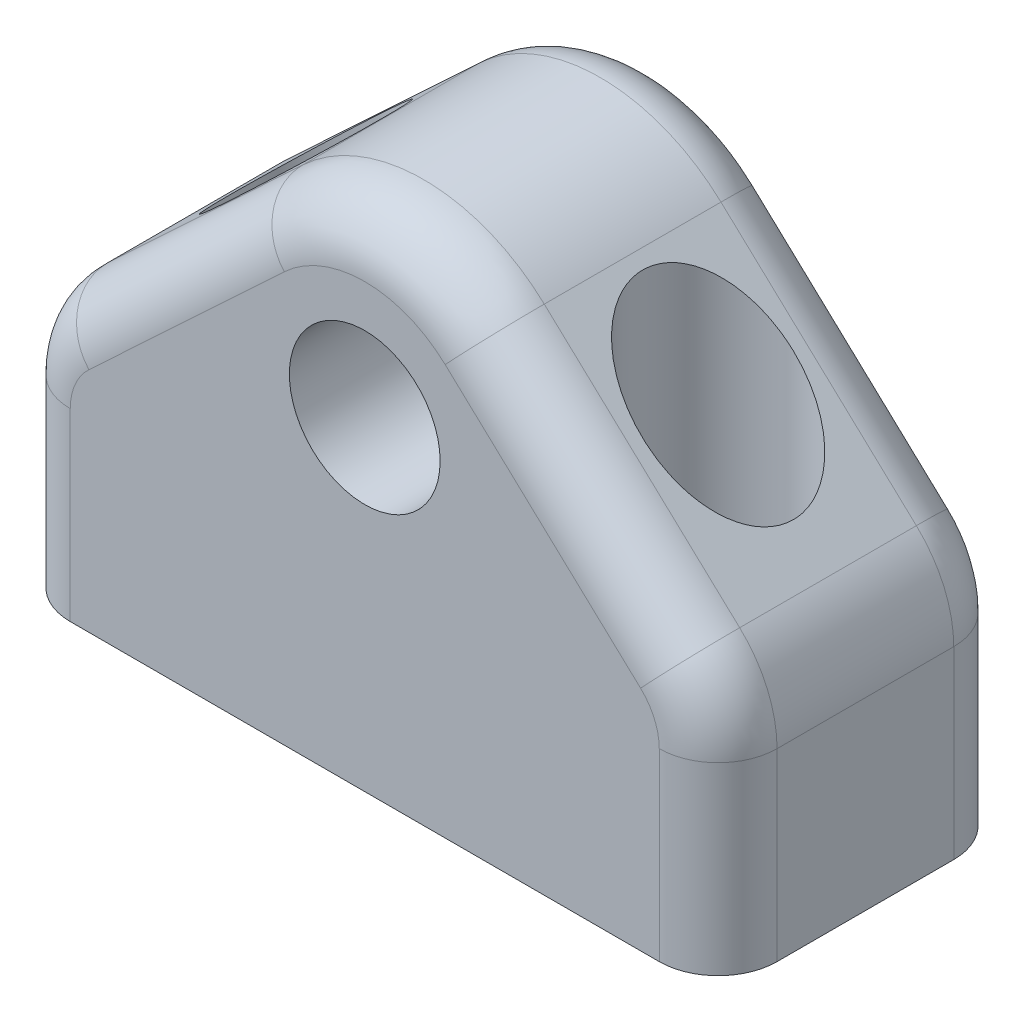
ISO-10303-21;
HEADER;
FILE_DESCRIPTION(('STEP AP214'),'2;1');
FILE_NAME('part.step','',(''),(''),'','','');
FILE_SCHEMA(('AUTOMOTIVE_DESIGN { 1 0 10303 214 1 1 1 1 }'));
ENDSEC;
DATA;
#1=APPLICATION_CONTEXT('core data for automotive mechanical design processes');
#2=APPLICATION_PROTOCOL_DEFINITION('international standard','automotive_design',2000,#1);
#3=PRODUCT_CONTEXT('',#1,'mechanical');
#4=PRODUCT('Part','Part','',(#3));
#5=PRODUCT_RELATED_PRODUCT_CATEGORY('part','',(#4));
#6=PRODUCT_DEFINITION_FORMATION('','',#4);
#7=PRODUCT_DEFINITION_CONTEXT('part definition',#1,'design');
#8=PRODUCT_DEFINITION('design','',#6,#7);
#9=PRODUCT_DEFINITION_SHAPE('','',#8);
#10=(LENGTH_UNIT() NAMED_UNIT(*) SI_UNIT(.MILLI.,.METRE.));
#11=(NAMED_UNIT(*) PLANE_ANGLE_UNIT() SI_UNIT($,.RADIAN.));
#12=(NAMED_UNIT(*) SI_UNIT($,.STERADIAN.) SOLID_ANGLE_UNIT());
#13=UNCERTAINTY_MEASURE_WITH_UNIT(LENGTH_MEASURE(1.E-05),#10,'distance_accuracy_value','');
#14=(GEOMETRIC_REPRESENTATION_CONTEXT(3) GLOBAL_UNCERTAINTY_ASSIGNED_CONTEXT((#13)) GLOBAL_UNIT_ASSIGNED_CONTEXT((#10,
#11,#12)) REPRESENTATION_CONTEXT('',''));
#15=CARTESIAN_POINT('',(0.,0.,0.));
#16=DIRECTION('',(0.,0.,1.));
#17=DIRECTION('',(1.,0.,0.));
#18=AXIS2_PLACEMENT_3D('',#15,#16,#17);
#19=CARTESIAN_POINT('',(3.175,4.97122911673364,7.9375));
#20=DIRECTION('',(0.,0.,-1.));
#21=DIRECTION('',(-1.,0.,0.));
#22=AXIS2_PLACEMENT_3D('',#19,#20,#21);
#23=PLANE('',#22);
#24=DIRECTION('',(1.,0.,0.));
#25=VECTOR('',#24,1.);
#26=CARTESIAN_POINT('',(19.05,0.,7.9375));
#27=LINE('',#26,#25);
#28=CARTESIAN_POINT('',(1.58750000000001,0.,7.9375));
#29=VERTEX_POINT('',#28);
#30=CARTESIAN_POINT('',(17.4625,0.,7.9375));
#31=VERTEX_POINT('',#30);
#32=EDGE_CURVE('E322',#29,#31,#27,.T.);
#33=ORIENTED_EDGE('',*,*,#32,.T.);
#34=DIRECTION('',(0.,1.,0.));
#35=VECTOR('',#34,1.);
#36=CARTESIAN_POINT('',(17.4625,4.97122911673364,7.9375));
#37=LINE('',#36,#35);
#38=CARTESIAN_POINT('',(17.4625,4.97122911673364,7.9375));
#39=VERTEX_POINT('',#38);
#40=EDGE_CURVE('E422',#31,#39,#37,.T.);
#41=ORIENTED_EDGE('',*,*,#40,.T.);
#42=CARTESIAN_POINT('',(15.875,4.97122911673364,7.9375));
#43=DIRECTION('',(0.,0.,-1.));
#44=DIRECTION('',(-1.,0.,0.));
#45=AXIS2_PLACEMENT_3D('',#42,#43,#44);
#46=CIRCLE('',#45,1.5875);
#47=CARTESIAN_POINT('',(16.9587536852823,6.13124385786283,7.9375));
#48=VERTEX_POINT('',#47);
#49=EDGE_CURVE('E73',#39,#48,#46,.F.);
#50=ORIENTED_EDGE('',*,*,#49,.T.);
#51=DIRECTION('',(-0.730717947167998,0.682679486791999,0.));
#52=VECTOR('',#51,1.);
#53=CARTESIAN_POINT('',(10.177604962702,12.4665900030247,7.9375));
#54=LINE('',#53,#52);
#55=CARTESIAN_POINT('',(11.6925073705646,11.0512794822584,7.9375));
#56=VERTEX_POINT('',#55);
#57=EDGE_CURVE('E417',#48,#56,#54,.T.);
#58=ORIENTED_EDGE('',*,*,#57,.T.);
#59=CARTESIAN_POINT('',(9.525,8.73125,7.9375));
#60=DIRECTION('',(0.,0.,-1.));
#61=DIRECTION('',(-1.,0.,0.));
#62=AXIS2_PLACEMENT_3D('',#59,#60,#61);
#63=CIRCLE('',#62,3.175);
#64=CARTESIAN_POINT('',(7.3574926294354,11.0512794822584,7.9375));
#65=VERTEX_POINT('',#64);
#66=EDGE_CURVE('E406',#56,#65,#63,.F.);
#67=ORIENTED_EDGE('',*,*,#66,.T.);
#68=DIRECTION('',(-0.730717947167998,-0.682679486791999,0.));
#69=VECTOR('',#68,1.);
#70=CARTESIAN_POINT('',(2.0912463147177,6.13124385786283,7.9375));
#71=LINE('',#70,#69);
#72=CARTESIAN_POINT('',(2.0912463147177,6.13124385786283,7.9375));
#73=VERTEX_POINT('',#72);
#74=EDGE_CURVE('E415',#65,#73,#71,.T.);
#75=ORIENTED_EDGE('',*,*,#74,.T.);
#76=CARTESIAN_POINT('',(3.175,4.97122911673364,7.9375));
#77=DIRECTION('',(0.,0.,-1.));
#78=DIRECTION('',(-1.,0.,0.));
#79=AXIS2_PLACEMENT_3D('',#76,#77,#78);
#80=CIRCLE('',#79,1.5875);
#81=CARTESIAN_POINT('',(1.5875,4.97122911673364,7.9375));
#82=VERTEX_POINT('',#81);
#83=EDGE_CURVE('E414',#73,#82,#80,.F.);
#84=ORIENTED_EDGE('',*,*,#83,.T.);
#85=DIRECTION('',(0.,-1.,0.));
#86=VECTOR('',#85,1.);
#87=CARTESIAN_POINT('',(1.5875,4.97122911673364,7.9375));
#88=LINE('',#87,#86);
#89=EDGE_CURVE('E416',#82,#29,#88,.T.);
#90=ORIENTED_EDGE('',*,*,#89,.T.);
#91=EDGE_LOOP('',(#33,#41,#50,#58,#67,#75,#84,#90));
#92=FACE_BOUND('',#91,.T.);
#93=CARTESIAN_POINT('',(9.525,8.73125,7.9375));
#94=DIRECTION('',(0.,0.,1.));
#95=DIRECTION('',(1.,0.,0.));
#96=AXIS2_PLACEMENT_3D('',#93,#94,#95);
#97=CIRCLE('',#96,2.032);
#98=CARTESIAN_POINT('',(11.557,8.73125,7.9375));
#99=VERTEX_POINT('',#98);
#100=EDGE_CURVE('E311',#99,#99,#97,.T.);
#101=ORIENTED_EDGE('',*,*,#100,.F.);
#102=EDGE_LOOP('',(#101));
#103=FACE_BOUND('',#102,.T.);
#104=ADVANCED_FACE('F44',(#92,#103),#23,.F.);
#105=CARTESIAN_POINT('',(3.175,4.97122911673364,0.));
#106=DIRECTION('',(0.,0.,-1.));
#107=DIRECTION('',(-1.,0.,0.));
#108=AXIS2_PLACEMENT_3D('',#105,#106,#107);
#109=PLANE('',#108);
#110=CARTESIAN_POINT('',(15.875,4.97122911673364,0.));
#111=DIRECTION('',(0.,0.,-1.));
#112=DIRECTION('',(-1.,0.,0.));
#113=AXIS2_PLACEMENT_3D('',#110,#111,#112);
#114=CIRCLE('',#113,1.5875);
#115=CARTESIAN_POINT('',(16.9587536852823,6.13124385786284,0.));
#116=VERTEX_POINT('',#115);
#117=CARTESIAN_POINT('',(17.4625,4.97122911673364,0.));
#118=VERTEX_POINT('',#117);
#119=EDGE_CURVE('E367',#116,#118,#114,.T.);
#120=ORIENTED_EDGE('',*,*,#119,.T.);
#121=DIRECTION('',(0.,1.,0.));
#122=VECTOR('',#121,1.);
#123=CARTESIAN_POINT('',(17.4625,0.,0.));
#124=LINE('',#123,#122);
#125=CARTESIAN_POINT('',(17.4625,0.,0.));
#126=VERTEX_POINT('',#125);
#127=EDGE_CURVE('E375',#118,#126,#124,.F.);
#128=ORIENTED_EDGE('',*,*,#127,.T.);
#129=DIRECTION('',(1.,0.,0.));
#130=VECTOR('',#129,1.);
#131=CARTESIAN_POINT('',(19.05,0.,0.));
#132=LINE('',#131,#130);
#133=CARTESIAN_POINT('',(1.58750000000001,0.,0.));
#134=VERTEX_POINT('',#133);
#135=EDGE_CURVE('E314',#134,#126,#132,.T.);
#136=ORIENTED_EDGE('',*,*,#135,.F.);
#137=DIRECTION('',(0.,-1.,0.));
#138=VECTOR('',#137,1.);
#139=CARTESIAN_POINT('',(1.5875,4.97122911673364,0.));
#140=LINE('',#139,#138);
#141=CARTESIAN_POINT('',(1.5875,4.97122911673364,0.));
#142=VERTEX_POINT('',#141);
#143=EDGE_CURVE('E364',#134,#142,#140,.F.);
#144=ORIENTED_EDGE('',*,*,#143,.T.);
#145=CARTESIAN_POINT('',(3.175,4.97122911673364,0.));
#146=DIRECTION('',(0.,0.,-1.));
#147=DIRECTION('',(-1.,0.,0.));
#148=AXIS2_PLACEMENT_3D('',#145,#146,#147);
#149=CIRCLE('',#148,1.5875);
#150=CARTESIAN_POINT('',(2.0912463147177,6.13124385786283,0.));
#151=VERTEX_POINT('',#150);
#152=EDGE_CURVE('E365',#142,#151,#149,.T.);
#153=ORIENTED_EDGE('',*,*,#152,.T.);
#154=DIRECTION('',(-0.730717947167998,-0.682679486791999,0.));
#155=VECTOR('',#154,1.);
#156=CARTESIAN_POINT('',(7.3574926294354,11.0512794822584,0.));
#157=LINE('',#156,#155);
#158=CARTESIAN_POINT('',(7.3574926294354,11.0512794822584,0.));
#159=VERTEX_POINT('',#158);
#160=EDGE_CURVE('E360',#151,#159,#157,.F.);
#161=ORIENTED_EDGE('',*,*,#160,.T.);
#162=CARTESIAN_POINT('',(9.525,8.73125,0.));
#163=DIRECTION('',(0.,0.,-1.));
#164=DIRECTION('',(-1.,0.,0.));
#165=AXIS2_PLACEMENT_3D('',#162,#163,#164);
#166=CIRCLE('',#165,3.175);
#167=CARTESIAN_POINT('',(11.6925073705646,11.0512794822584,0.));
#168=VERTEX_POINT('',#167);
#169=EDGE_CURVE('E358',#159,#168,#166,.T.);
#170=ORIENTED_EDGE('',*,*,#169,.T.);
#171=DIRECTION('',(-0.730717947167998,0.682679486791999,0.));
#172=VECTOR('',#171,1.);
#173=CARTESIAN_POINT('',(16.9587536852823,6.13124385786283,0.));
#174=LINE('',#173,#172);
#175=EDGE_CURVE('E366',#168,#116,#174,.F.);
#176=ORIENTED_EDGE('',*,*,#175,.T.);
#177=EDGE_LOOP('',(#120,#128,#136,#144,#153,#161,#170,#176));
#178=FACE_BOUND('',#177,.T.);
#179=CARTESIAN_POINT('',(9.525,8.73125,0.));
#180=DIRECTION('',(0.,0.,1.));
#181=DIRECTION('',(1.,0.,0.));
#182=AXIS2_PLACEMENT_3D('',#179,#180,#181);
#183=CIRCLE('',#182,2.032);
#184=CARTESIAN_POINT('',(11.557,8.73125,0.));
#185=VERTEX_POINT('',#184);
#186=EDGE_CURVE('E317',#185,#185,#183,.T.);
#187=ORIENTED_EDGE('',*,*,#186,.T.);
#188=EDGE_LOOP('',(#187));
#189=FACE_BOUND('',#188,.T.);
#190=ADVANCED_FACE('F466',(#178,#189),#109,.T.);
#191=CARTESIAN_POINT('',(19.05,0.,7.9375));
#192=DIRECTION('',(0.,1.,0.));
#193=DIRECTION('',(0.,0.,1.));
#194=AXIS2_PLACEMENT_3D('',#191,#192,#193);
#195=PLANE('',#194);
#196=CARTESIAN_POINT('',(3.96875,0.,3.96875));
#197=DIRECTION('',(0.,-1.,0.));
#198=DIRECTION('',(0.,0.,-1.));
#199=AXIS2_PLACEMENT_3D('',#196,#197,#198);
#200=CIRCLE('',#199,2.032);
#201=CARTESIAN_POINT('',(3.96875,0.,1.93675));
#202=VERTEX_POINT('',#201);
#203=EDGE_CURVE('E297',#202,#202,#200,.T.);
#204=ORIENTED_EDGE('',*,*,#203,.F.);
#205=EDGE_LOOP('',(#204));
#206=FACE_BOUND('',#205,.T.);
#207=CARTESIAN_POINT('',(15.08125,0.,3.96875));
#208=DIRECTION('',(0.,-1.,0.));
#209=DIRECTION('',(0.,0.,-1.));
#210=AXIS2_PLACEMENT_3D('',#207,#208,#209);
#211=CIRCLE('',#210,2.03200000000001);
#212=CARTESIAN_POINT('',(15.08125,0.,1.93674999999999));
#213=VERTEX_POINT('',#212);
#214=EDGE_CURVE('E293',#213,#213,#211,.T.);
#215=ORIENTED_EDGE('',*,*,#214,.F.);
#216=EDGE_LOOP('',(#215));
#217=FACE_BOUND('',#216,.T.);
#218=ORIENTED_EDGE('',*,*,#135,.T.);
#219=CARTESIAN_POINT('',(17.4625,0.,1.5875));
#220=DIRECTION('',(0.,1.,0.));
#221=DIRECTION('',(0.,0.,1.));
#222=AXIS2_PLACEMENT_3D('',#219,#220,#221);
#223=CIRCLE('',#222,1.5875);
#224=CARTESIAN_POINT('',(19.05,0.,1.5875));
#225=VERTEX_POINT('',#224);
#226=EDGE_CURVE('E207',#126,#225,#223,.F.);
#227=ORIENTED_EDGE('',*,*,#226,.T.);
#228=DIRECTION('',(0.,0.,-1.));
#229=VECTOR('',#228,1.);
#230=CARTESIAN_POINT('',(19.05,0.,7.9375));
#231=LINE('',#230,#229);
#232=CARTESIAN_POINT('',(19.05,0.,6.35));
#233=VERTEX_POINT('',#232);
#234=EDGE_CURVE('E220',#233,#225,#231,.T.);
#235=ORIENTED_EDGE('',*,*,#234,.F.);
#236=CARTESIAN_POINT('',(17.4625,0.,6.35));
#237=DIRECTION('',(0.,1.,0.));
#238=DIRECTION('',(0.,0.,1.));
#239=AXIS2_PLACEMENT_3D('',#236,#237,#238);
#240=CIRCLE('',#239,1.5875);
#241=EDGE_CURVE('E221',#233,#31,#240,.F.);
#242=ORIENTED_EDGE('',*,*,#241,.T.);
#243=ORIENTED_EDGE('',*,*,#32,.F.);
#244=CARTESIAN_POINT('',(1.5875,0.,6.35));
#245=DIRECTION('',(0.,1.,0.));
#246=DIRECTION('',(0.,0.,1.));
#247=AXIS2_PLACEMENT_3D('',#244,#245,#246);
#248=CIRCLE('',#247,1.5875);
#249=CARTESIAN_POINT('',(0.,0.,6.35));
#250=VERTEX_POINT('',#249);
#251=EDGE_CURVE('E374',#29,#250,#248,.F.);
#252=ORIENTED_EDGE('',*,*,#251,.T.);
#253=DIRECTION('',(0.,0.,-1.));
#254=VECTOR('',#253,1.);
#255=CARTESIAN_POINT('',(0.,0.,7.9375));
#256=LINE('',#255,#254);
#257=CARTESIAN_POINT('',(0.,0.,1.5875));
#258=VERTEX_POINT('',#257);
#259=EDGE_CURVE('E321',#250,#258,#256,.T.);
#260=ORIENTED_EDGE('',*,*,#259,.T.);
#261=CARTESIAN_POINT('',(1.5875,0.,1.5875));
#262=DIRECTION('',(0.,1.,0.));
#263=DIRECTION('',(0.,0.,1.));
#264=AXIS2_PLACEMENT_3D('',#261,#262,#263);
#265=CIRCLE('',#264,1.5875);
#266=EDGE_CURVE('E379',#258,#134,#265,.F.);
#267=ORIENTED_EDGE('',*,*,#266,.T.);
#268=EDGE_LOOP('',(#218,#227,#235,#242,#243,#252,#260,#267));
#269=FACE_BOUND('',#268,.T.);
#270=ADVANCED_FACE('F458',(#206,#217,#269),#195,.F.);
#271=CARTESIAN_POINT('',(19.05,4.97122911673364,7.9375));
#272=DIRECTION('',(-1.,0.,0.));
#273=DIRECTION('',(0.,0.,1.));
#274=AXIS2_PLACEMENT_3D('',#271,#272,#273);
#275=PLANE('',#274);
#276=ORIENTED_EDGE('',*,*,#234,.T.);
#277=DIRECTION('',(0.,1.,0.));
#278=VECTOR('',#277,1.);
#279=CARTESIAN_POINT('',(19.05,4.97122911673364,1.5875));
#280=LINE('',#279,#278);
#281=CARTESIAN_POINT('',(19.05,4.97122911673364,1.5875));
#282=VERTEX_POINT('',#281);
#283=EDGE_CURVE('E213',#225,#282,#280,.T.);
#284=ORIENTED_EDGE('',*,*,#283,.T.);
#285=DIRECTION('',(0.,0.,-1.));
#286=VECTOR('',#285,1.);
#287=CARTESIAN_POINT('',(19.05,4.97122911673364,7.9375));
#288=LINE('',#287,#286);
#289=CARTESIAN_POINT('',(19.05,4.97122911673364,6.35));
#290=VERTEX_POINT('',#289);
#291=EDGE_CURVE('E196',#290,#282,#288,.T.);
#292=ORIENTED_EDGE('',*,*,#291,.F.);
#293=DIRECTION('',(0.,1.,0.));
#294=VECTOR('',#293,1.);
#295=CARTESIAN_POINT('',(19.05,4.97122911673364,6.35));
#296=LINE('',#295,#294);
#297=EDGE_CURVE('E215',#290,#233,#296,.F.);
#298=ORIENTED_EDGE('',*,*,#297,.T.);
#299=EDGE_LOOP('',(#276,#284,#292,#298));
#300=FACE_BOUND('',#299,.T.);
#301=ADVANCED_FACE('F212',(#300),#275,.F.);
#302=CARTESIAN_POINT('',(15.875,4.97122911673364,7.9375));
#303=DIRECTION('',(0.,0.,-1.));
#304=DIRECTION('',(-1.,0.,0.));
#305=AXIS2_PLACEMENT_3D('',#302,#303,#304);
#306=CYLINDRICAL_SURFACE('',#305,3.175);
#307=ORIENTED_EDGE('',*,*,#291,.T.);
#308=CARTESIAN_POINT('',(15.875,4.97122911673364,1.5875));
#309=DIRECTION('',(0.,0.,-1.));
#310=DIRECTION('',(-1.,0.,0.));
#311=AXIS2_PLACEMENT_3D('',#308,#309,#310);
#312=CIRCLE('',#311,3.175);
#313=CARTESIAN_POINT('',(18.0425073705646,7.29125859899203,1.5875));
#314=VERTEX_POINT('',#313);
#315=EDGE_CURVE('E204',#282,#314,#312,.F.);
#316=ORIENTED_EDGE('',*,*,#315,.T.);
#317=DIRECTION('',(0.,0.,-1.));
#318=VECTOR('',#317,1.);
#319=CARTESIAN_POINT('',(18.0425073705646,7.29125859899203,7.9375));
#320=LINE('',#319,#318);
#321=CARTESIAN_POINT('',(18.0425073705646,7.29125859899203,6.35));
#322=VERTEX_POINT('',#321);
#323=EDGE_CURVE('E197',#322,#314,#320,.T.);
#324=ORIENTED_EDGE('',*,*,#323,.F.);
#325=CARTESIAN_POINT('',(15.875,4.97122911673364,6.35));
#326=DIRECTION('',(0.,0.,-1.));
#327=DIRECTION('',(-1.,0.,0.));
#328=AXIS2_PLACEMENT_3D('',#325,#326,#327);
#329=CIRCLE('',#328,3.175);
#330=EDGE_CURVE('E193',#322,#290,#329,.T.);
#331=ORIENTED_EDGE('',*,*,#330,.T.);
#332=EDGE_LOOP('',(#307,#316,#324,#331));
#333=FACE_BOUND('',#332,.T.);
#334=ADVANCED_FACE('F200',(#333),#306,.T.);
#335=CARTESIAN_POINT('',(12.7762610558469,12.2112942233876,7.9375));
#336=DIRECTION('',(-0.682679486791999,-0.730717947167998,0.));
#337=DIRECTION('',(0.730717947167998,-0.682679486791999,0.));
#338=AXIS2_PLACEMENT_3D('',#335,#336,#337);
#339=PLANE('',#338);
#340=CARTESIAN_POINT('',(15.08125,10.057838604083,3.96875));
#341=DIRECTION('',(-0.682679486791999,-0.730717947167998,0.));
#342=DIRECTION('',(0.730717947167998,-0.682679486791999,0.));
#343=AXIS2_PLACEMENT_3D('',#340,#341,#342);
#344=ELLIPSE('',#343,2.78082673058095,2.03200000000001);
#345=CARTESIAN_POINT('',(17.11325,8.15942523879248,3.96875));
#346=VERTEX_POINT('',#345);
#347=EDGE_CURVE('E318',#346,#346,#344,.T.);
#348=ORIENTED_EDGE('',*,*,#347,.T.);
#349=EDGE_LOOP('',(#348));
#350=FACE_BOUND('',#349,.T.);
#351=ORIENTED_EDGE('',*,*,#323,.T.);
#352=DIRECTION('',(-0.730717947167998,0.682679486791999,0.));
#353=VECTOR('',#352,1.);
#354=CARTESIAN_POINT('',(12.7762610558469,12.2112942233876,1.5875));
#355=LINE('',#354,#353);
#356=CARTESIAN_POINT('',(12.7762610558469,12.2112942233876,1.5875));
#357=VERTEX_POINT('',#356);
#358=EDGE_CURVE('E386',#314,#357,#355,.T.);
#359=ORIENTED_EDGE('',*,*,#358,.T.);
#360=DIRECTION('',(0.,0.,-1.));
#361=VECTOR('',#360,1.);
#362=CARTESIAN_POINT('',(12.7762610558469,12.2112942233876,7.9375));
#363=LINE('',#362,#361);
#364=CARTESIAN_POINT('',(12.7762610558469,12.2112942233876,6.35));
#365=VERTEX_POINT('',#364);
#366=EDGE_CURVE('E344',#365,#357,#363,.T.);
#367=ORIENTED_EDGE('',*,*,#366,.F.);
#368=DIRECTION('',(-0.730717947167998,0.682679486791999,0.));
#369=VECTOR('',#368,1.);
#370=CARTESIAN_POINT('',(12.7762610558469,12.2112942233876,6.35));
#371=LINE('',#370,#369);
#372=EDGE_CURVE('E387',#365,#322,#371,.F.);
#373=ORIENTED_EDGE('',*,*,#372,.T.);
#374=EDGE_LOOP('',(#351,#359,#367,#373));
#375=FACE_BOUND('',#374,.T.);
#376=ADVANCED_FACE('F434',(#350,#375),#339,.F.);
#377=CARTESIAN_POINT('',(9.525,8.73125,7.9375));
#378=DIRECTION('',(0.,0.,-1.));
#379=DIRECTION('',(-1.,0.,0.));
#380=AXIS2_PLACEMENT_3D('',#377,#378,#379);
#381=CYLINDRICAL_SURFACE('',#380,4.7625);
#382=ORIENTED_EDGE('',*,*,#366,.T.);
#383=CARTESIAN_POINT('',(9.525,8.73125,1.5875));
#384=DIRECTION('',(0.,0.,-1.));
#385=DIRECTION('',(-1.,0.,0.));
#386=AXIS2_PLACEMENT_3D('',#383,#384,#385);
#387=CIRCLE('',#386,4.7625);
#388=CARTESIAN_POINT('',(6.2737389441531,12.2112942233876,1.5875));
#389=VERTEX_POINT('',#388);
#390=EDGE_CURVE('E11',#357,#389,#387,.F.);
#391=ORIENTED_EDGE('',*,*,#390,.T.);
#392=DIRECTION('',(0.,0.,-1.));
#393=VECTOR('',#392,1.);
#394=CARTESIAN_POINT('',(6.2737389441531,12.2112942233876,7.9375));
#395=LINE('',#394,#393);
#396=CARTESIAN_POINT('',(6.2737389441531,12.2112942233876,6.35));
#397=VERTEX_POINT('',#396);
#398=EDGE_CURVE('E339',#397,#389,#395,.T.);
#399=ORIENTED_EDGE('',*,*,#398,.F.);
#400=CARTESIAN_POINT('',(9.525,8.73125,6.35));
#401=DIRECTION('',(0.,0.,-1.));
#402=DIRECTION('',(-1.,0.,0.));
#403=AXIS2_PLACEMENT_3D('',#400,#401,#402);
#404=CIRCLE('',#403,4.7625);
#405=EDGE_CURVE('E54',#397,#365,#404,.T.);
#406=ORIENTED_EDGE('',*,*,#405,.T.);
#407=EDGE_LOOP('',(#382,#391,#399,#406));
#408=FACE_BOUND('',#407,.T.);
#409=ADVANCED_FACE('F429',(#408),#381,.T.);
#410=CARTESIAN_POINT('',(1.0074926294354,7.29125859899203,7.9375));
#411=DIRECTION('',(0.682679486791999,-0.730717947167997,0.));
#412=DIRECTION('',(0.730717947167998,0.682679486791999,0.));
#413=AXIS2_PLACEMENT_3D('',#410,#411,#412);
#414=PLANE('',#413);
#415=CARTESIAN_POINT('',(3.96875,10.057838604083,3.96875));
#416=DIRECTION('',(0.682679486791999,-0.730717947167997,0.));
#417=DIRECTION('',(-0.730717947167998,-0.682679486792,0.));
#418=AXIS2_PLACEMENT_3D('',#415,#416,#417);
#419=ELLIPSE('',#418,2.78082673058094,2.032);
#420=CARTESIAN_POINT('',(1.93675,8.15942523879248,3.96875));
#421=VERTEX_POINT('',#420);
#422=EDGE_CURVE('E308',#421,#421,#419,.T.);
#423=ORIENTED_EDGE('',*,*,#422,.T.);
#424=EDGE_LOOP('',(#423));
#425=FACE_BOUND('',#424,.T.);
#426=ORIENTED_EDGE('',*,*,#398,.T.);
#427=DIRECTION('',(-0.730717947167998,-0.682679486791999,0.));
#428=VECTOR('',#427,1.);
#429=CARTESIAN_POINT('',(1.0074926294354,7.29125859899203,1.5875));
#430=LINE('',#429,#428);
#431=CARTESIAN_POINT('',(1.0074926294354,7.29125859899203,1.5875));
#432=VERTEX_POINT('',#431);
#433=EDGE_CURVE('E407',#389,#432,#430,.T.);
#434=ORIENTED_EDGE('',*,*,#433,.T.);
#435=DIRECTION('',(0.,0.,-1.));
#436=VECTOR('',#435,1.);
#437=CARTESIAN_POINT('',(1.0074926294354,7.29125859899203,7.9375));
#438=LINE('',#437,#436);
#439=CARTESIAN_POINT('',(1.0074926294354,7.29125859899203,6.35));
#440=VERTEX_POINT('',#439);
#441=EDGE_CURVE('E334',#440,#432,#438,.T.);
#442=ORIENTED_EDGE('',*,*,#441,.F.);
#443=DIRECTION('',(-0.730717947167998,-0.682679486791999,0.));
#444=VECTOR('',#443,1.);
#445=CARTESIAN_POINT('',(1.0074926294354,7.29125859899203,6.35));
#446=LINE('',#445,#444);
#447=EDGE_CURVE('E401',#440,#397,#446,.F.);
#448=ORIENTED_EDGE('',*,*,#447,.T.);
#449=EDGE_LOOP('',(#426,#434,#442,#448));
#450=FACE_BOUND('',#449,.T.);
#451=ADVANCED_FACE('F447',(#425,#450),#414,.F.);
#452=CARTESIAN_POINT('',(3.175,4.97122911673364,7.9375));
#453=DIRECTION('',(0.,0.,-1.));
#454=DIRECTION('',(-1.,0.,0.));
#455=AXIS2_PLACEMENT_3D('',#452,#453,#454);
#456=CYLINDRICAL_SURFACE('',#455,3.175);
#457=ORIENTED_EDGE('',*,*,#441,.T.);
#458=CARTESIAN_POINT('',(3.175,4.97122911673364,1.5875));
#459=DIRECTION('',(0.,0.,-1.));
#460=DIRECTION('',(-1.,0.,0.));
#461=AXIS2_PLACEMENT_3D('',#458,#459,#460);
#462=CIRCLE('',#461,3.175);
#463=CARTESIAN_POINT('',(0.,4.97122911673364,1.5875));
#464=VERTEX_POINT('',#463);
#465=EDGE_CURVE('E399',#432,#464,#462,.F.);
#466=ORIENTED_EDGE('',*,*,#465,.T.);
#467=DIRECTION('',(0.,0.,-1.));
#468=VECTOR('',#467,1.);
#469=CARTESIAN_POINT('',(0.,4.97122911673364,7.9375));
#470=LINE('',#469,#468);
#471=CARTESIAN_POINT('',(0.,4.97122911673364,6.35));
#472=VERTEX_POINT('',#471);
#473=EDGE_CURVE('E331',#472,#464,#470,.T.);
#474=ORIENTED_EDGE('',*,*,#473,.F.);
#475=CARTESIAN_POINT('',(3.175,4.97122911673364,6.35));
#476=DIRECTION('',(0.,0.,-1.));
#477=DIRECTION('',(-1.,0.,0.));
#478=AXIS2_PLACEMENT_3D('',#475,#476,#477);
#479=CIRCLE('',#478,3.175);
#480=EDGE_CURVE('E397',#472,#440,#479,.T.);
#481=ORIENTED_EDGE('',*,*,#480,.T.);
#482=EDGE_LOOP('',(#457,#466,#474,#481));
#483=FACE_BOUND('',#482,.T.);
#484=ADVANCED_FACE('F484',(#483),#456,.T.);
#485=CARTESIAN_POINT('',(0.,0.,7.9375));
#486=DIRECTION('',(1.,0.,0.));
#487=DIRECTION('',(0.,0.,-1.));
#488=AXIS2_PLACEMENT_3D('',#485,#486,#487);
#489=PLANE('',#488);
#490=ORIENTED_EDGE('',*,*,#473,.T.);
#491=DIRECTION('',(0.,-1.,0.));
#492=VECTOR('',#491,1.);
#493=CARTESIAN_POINT('',(0.,0.,1.5875));
#494=LINE('',#493,#492);
#495=EDGE_CURVE('E392',#464,#258,#494,.T.);
#496=ORIENTED_EDGE('',*,*,#495,.T.);
#497=ORIENTED_EDGE('',*,*,#259,.F.);
#498=DIRECTION('',(0.,-1.,0.));
#499=VECTOR('',#498,1.);
#500=CARTESIAN_POINT('',(0.,0.,6.35));
#501=LINE('',#500,#499);
#502=EDGE_CURVE('E395',#250,#472,#501,.F.);
#503=ORIENTED_EDGE('',*,*,#502,.T.);
#504=EDGE_LOOP('',(#490,#496,#497,#503));
#505=FACE_BOUND('',#504,.T.);
#506=ADVANCED_FACE('F459',(#505),#489,.F.);
#507=CARTESIAN_POINT('',(9.525,8.73125,7.9375));
#508=DIRECTION('',(0.,0.,-1.));
#509=DIRECTION('',(-1.,0.,0.));
#510=AXIS2_PLACEMENT_3D('',#507,#508,#509);
#511=CYLINDRICAL_SURFACE('',#510,2.032);
#512=ORIENTED_EDGE('',*,*,#100,.T.);
#513=EDGE_LOOP('',(#512));
#514=FACE_BOUND('',#513,.T.);
#515=ORIENTED_EDGE('',*,*,#186,.F.);
#516=EDGE_LOOP('',(#515));
#517=FACE_BOUND('',#516,.T.);
#518=ADVANCED_FACE('F495',(#514,#517),#511,.F.);
#519=CARTESIAN_POINT('',(3.96875,13.49375,3.96875));
#520=DIRECTION('',(0.,-1.,0.));
#521=DIRECTION('',(0.,0.,-1.));
#522=AXIS2_PLACEMENT_3D('',#519,#520,#521);
#523=CYLINDRICAL_SURFACE('',#522,2.032);
#524=ORIENTED_EDGE('',*,*,#203,.T.);
#525=EDGE_LOOP('',(#524));
#526=FACE_BOUND('',#525,.T.);
#527=ORIENTED_EDGE('',*,*,#422,.F.);
#528=EDGE_LOOP('',(#527));
#529=FACE_BOUND('',#528,.T.);
#530=ADVANCED_FACE('F504',(#526,#529),#523,.F.);
#531=CARTESIAN_POINT('',(15.08125,13.49375,3.96875));
#532=DIRECTION('',(0.,-1.,0.));
#533=DIRECTION('',(0.,0.,-1.));
#534=AXIS2_PLACEMENT_3D('',#531,#532,#533);
#535=CYLINDRICAL_SURFACE('',#534,2.03200000000001);
#536=ORIENTED_EDGE('',*,*,#214,.T.);
#537=EDGE_LOOP('',(#536));
#538=FACE_BOUND('',#537,.T.);
#539=ORIENTED_EDGE('',*,*,#347,.F.);
#540=EDGE_LOOP('',(#539));
#541=FACE_BOUND('',#540,.T.);
#542=ADVANCED_FACE('F510',(#538,#541),#535,.F.);
#543=CARTESIAN_POINT('',(1.5875,0.,1.5875));
#544=DIRECTION('',(0.,1.,0.));
#545=DIRECTION('',(0.,0.,1.));
#546=AXIS2_PLACEMENT_3D('',#543,#544,#545);
#547=CYLINDRICAL_SURFACE('',#546,1.5875);
#548=ORIENTED_EDGE('',*,*,#266,.F.);
#549=ORIENTED_EDGE('',*,*,#495,.F.);
#550=CARTESIAN_POINT('',(1.5875,4.97122911673364,1.5875));
#551=DIRECTION('',(0.,1.,0.));
#552=DIRECTION('',(0.,0.,1.));
#553=AXIS2_PLACEMENT_3D('',#550,#551,#552);
#554=CIRCLE('',#553,1.5875);
#555=EDGE_CURVE('E231',#142,#464,#554,.T.);
#556=ORIENTED_EDGE('',*,*,#555,.F.);
#557=ORIENTED_EDGE('',*,*,#143,.F.);
#558=EDGE_LOOP('',(#548,#549,#556,#557));
#559=FACE_BOUND('',#558,.T.);
#560=ADVANCED_FACE('F462',(#559),#547,.T.);
#561=CARTESIAN_POINT('',(3.175,4.97122911673364,1.5875));
#562=DIRECTION('',(0.,0.,-1.));
#563=DIRECTION('',(-1.,0.,0.));
#564=AXIS2_PLACEMENT_3D('',#561,#562,#563);
#565=DEGENERATE_TOROIDAL_SURFACE('',#564,1.5875,1.5875,.T.);
#566=ORIENTED_EDGE('',*,*,#555,.T.);
#567=ORIENTED_EDGE('',*,*,#465,.F.);
#568=CARTESIAN_POINT('',(2.0912463147177,6.13124385786283,1.5875));
#569=DIRECTION('',(0.730717947167998,0.682679486791999,0.));
#570=DIRECTION('',(-0.682679486791999,0.730717947167998,0.));
#571=AXIS2_PLACEMENT_3D('',#568,#569,#570);
#572=CIRCLE('',#571,1.5875);
#573=EDGE_CURVE('E278',#151,#432,#572,.T.);
#574=ORIENTED_EDGE('',*,*,#573,.F.);
#575=ORIENTED_EDGE('',*,*,#152,.F.);
#576=EDGE_LOOP('',(#566,#567,#574,#575));
#577=FACE_BOUND('',#576,.T.);
#578=ADVANCED_FACE('F483',(#577),#565,.T.);
#579=CARTESIAN_POINT('',(2.0912463147177,6.13124385786283,1.5875));
#580=DIRECTION('',(0.730717947167998,0.682679486791999,0.));
#581=DIRECTION('',(-0.682679486791999,0.730717947167998,0.));
#582=AXIS2_PLACEMENT_3D('',#579,#580,#581);
#583=CYLINDRICAL_SURFACE('',#582,1.5875);
#584=ORIENTED_EDGE('',*,*,#573,.T.);
#585=ORIENTED_EDGE('',*,*,#433,.F.);
#586=CARTESIAN_POINT('',(7.3574926294354,11.0512794822584,1.5875));
#587=DIRECTION('',(0.730717947167997,0.682679486791999,0.));
#588=DIRECTION('',(-0.682679486791999,0.730717947167997,0.));
#589=AXIS2_PLACEMENT_3D('',#586,#587,#588);
#590=CIRCLE('',#589,1.5875);
#591=EDGE_CURVE('E280',#159,#389,#590,.T.);
#592=ORIENTED_EDGE('',*,*,#591,.F.);
#593=ORIENTED_EDGE('',*,*,#160,.F.);
#594=EDGE_LOOP('',(#584,#585,#592,#593));
#595=FACE_BOUND('',#594,.T.);
#596=ADVANCED_FACE('F482',(#595),#583,.T.);
#597=CARTESIAN_POINT('',(9.525,8.73125,1.5875));
#598=DIRECTION('',(0.,0.,-1.));
#599=DIRECTION('',(-1.,0.,0.));
#600=AXIS2_PLACEMENT_3D('',#597,#598,#599);
#601=TOROIDAL_SURFACE('',#600,3.175,1.5875);
#602=ORIENTED_EDGE('',*,*,#591,.T.);
#603=ORIENTED_EDGE('',*,*,#390,.F.);
#604=CARTESIAN_POINT('',(11.6925073705646,11.0512794822584,1.5875));
#605=DIRECTION('',(0.730717947167998,-0.682679486791999,0.));
#606=DIRECTION('',(0.682679486791999,0.730717947167998,0.));
#607=AXIS2_PLACEMENT_3D('',#604,#605,#606);
#608=CIRCLE('',#607,1.5875);
#609=EDGE_CURVE('E269',#168,#357,#608,.T.);
#610=ORIENTED_EDGE('',*,*,#609,.F.);
#611=ORIENTED_EDGE('',*,*,#169,.F.);
#612=EDGE_LOOP('',(#602,#603,#610,#611));
#613=FACE_BOUND('',#612,.T.);
#614=ADVANCED_FACE('F481',(#613),#601,.T.);
#615=CARTESIAN_POINT('',(11.6925073705646,11.0512794822584,1.5875));
#616=DIRECTION('',(0.730717947167998,-0.682679486791999,0.));
#617=DIRECTION('',(0.682679486791999,0.730717947167998,0.));
#618=AXIS2_PLACEMENT_3D('',#615,#616,#617);
#619=CYLINDRICAL_SURFACE('',#618,1.5875);
#620=ORIENTED_EDGE('',*,*,#609,.T.);
#621=ORIENTED_EDGE('',*,*,#358,.F.);
#622=CARTESIAN_POINT('',(16.9587536852823,6.13124385786284,1.5875));
#623=DIRECTION('',(0.730717947167998,-0.682679486791999,0.));
#624=DIRECTION('',(0.682679486791999,0.730717947167998,0.));
#625=AXIS2_PLACEMENT_3D('',#622,#623,#624);
#626=CIRCLE('',#625,1.5875);
#627=EDGE_CURVE('E258',#116,#314,#626,.T.);
#628=ORIENTED_EDGE('',*,*,#627,.F.);
#629=ORIENTED_EDGE('',*,*,#175,.F.);
#630=EDGE_LOOP('',(#620,#621,#628,#629));
#631=FACE_BOUND('',#630,.T.);
#632=ADVANCED_FACE('F478',(#631),#619,.T.);
#633=CARTESIAN_POINT('',(15.875,4.97122911673364,1.5875));
#634=DIRECTION('',(0.,0.,-1.));
#635=DIRECTION('',(-1.,0.,0.));
#636=AXIS2_PLACEMENT_3D('',#633,#634,#635);
#637=TOROIDAL_SURFACE('',#636,1.5875,1.5875);
#638=ORIENTED_EDGE('',*,*,#627,.T.);
#639=ORIENTED_EDGE('',*,*,#315,.F.);
#640=CARTESIAN_POINT('',(17.4625,4.97122911673364,1.5875));
#641=DIRECTION('',(0.,-1.,0.));
#642=DIRECTION('',(0.,0.,-1.));
#643=AXIS2_PLACEMENT_3D('',#640,#641,#642);
#644=CIRCLE('',#643,1.5875);
#645=EDGE_CURVE('E254',#118,#282,#644,.T.);
#646=ORIENTED_EDGE('',*,*,#645,.F.);
#647=ORIENTED_EDGE('',*,*,#119,.F.);
#648=EDGE_LOOP('',(#638,#639,#646,#647));
#649=FACE_BOUND('',#648,.T.);
#650=ADVANCED_FACE('F474',(#649),#637,.T.);
#651=CARTESIAN_POINT('',(17.4625,4.97122911673364,1.5875));
#652=DIRECTION('',(0.,-1.,0.));
#653=DIRECTION('',(0.,0.,-1.));
#654=AXIS2_PLACEMENT_3D('',#651,#652,#653);
#655=CYLINDRICAL_SURFACE('',#654,1.5875);
#656=ORIENTED_EDGE('',*,*,#226,.F.);
#657=ORIENTED_EDGE('',*,*,#127,.F.);
#658=ORIENTED_EDGE('',*,*,#645,.T.);
#659=ORIENTED_EDGE('',*,*,#283,.F.);
#660=EDGE_LOOP('',(#656,#657,#658,#659));
#661=FACE_BOUND('',#660,.T.);
#662=ADVANCED_FACE('F472',(#661),#655,.T.);
#663=CARTESIAN_POINT('',(1.5875,4.97122911673364,6.35));
#664=DIRECTION('',(0.,-1.,0.));
#665=DIRECTION('',(0.,0.,-1.));
#666=AXIS2_PLACEMENT_3D('',#663,#664,#665);
#667=CYLINDRICAL_SURFACE('',#666,1.5875);
#668=ORIENTED_EDGE('',*,*,#251,.F.);
#669=ORIENTED_EDGE('',*,*,#89,.F.);
#670=CARTESIAN_POINT('',(1.5875,4.97122911673364,6.35));
#671=DIRECTION('',(0.,1.,0.));
#672=DIRECTION('',(0.,0.,1.));
#673=AXIS2_PLACEMENT_3D('',#670,#671,#672);
#674=CIRCLE('',#673,1.5875);
#675=EDGE_CURVE('E47',#472,#82,#674,.T.);
#676=ORIENTED_EDGE('',*,*,#675,.F.);
#677=ORIENTED_EDGE('',*,*,#502,.F.);
#678=EDGE_LOOP('',(#668,#669,#676,#677));
#679=FACE_BOUND('',#678,.T.);
#680=ADVANCED_FACE('F50',(#679),#667,.T.);
#681=CARTESIAN_POINT('',(3.175,4.97122911673364,6.35));
#682=DIRECTION('',(0.,0.,-1.));
#683=DIRECTION('',(-1.,0.,0.));
#684=AXIS2_PLACEMENT_3D('',#681,#682,#683);
#685=DEGENERATE_TOROIDAL_SURFACE('',#684,1.5875,1.5875,.T.);
#686=ORIENTED_EDGE('',*,*,#675,.T.);
#687=ORIENTED_EDGE('',*,*,#83,.F.);
#688=CARTESIAN_POINT('',(2.0912463147177,6.13124385786283,6.35));
#689=DIRECTION('',(0.730717947167998,0.682679486791999,0.));
#690=DIRECTION('',(-0.682679486791999,0.730717947167998,0.));
#691=AXIS2_PLACEMENT_3D('',#688,#689,#690);
#692=CIRCLE('',#691,1.5875);
#693=EDGE_CURVE('E245',#440,#73,#692,.T.);
#694=ORIENTED_EDGE('',*,*,#693,.F.);
#695=ORIENTED_EDGE('',*,*,#480,.F.);
#696=EDGE_LOOP('',(#686,#687,#694,#695));
#697=FACE_BOUND('',#696,.T.);
#698=ADVANCED_FACE('F449',(#697),#685,.T.);
#699=CARTESIAN_POINT('',(2.0912463147177,6.13124385786283,6.35));
#700=DIRECTION('',(-0.730717947167998,-0.682679486791999,0.));
#701=DIRECTION('',(0.682679486791999,-0.730717947167998,0.));
#702=AXIS2_PLACEMENT_3D('',#699,#700,#701);
#703=CYLINDRICAL_SURFACE('',#702,1.5875);
#704=ORIENTED_EDGE('',*,*,#693,.T.);
#705=ORIENTED_EDGE('',*,*,#74,.F.);
#706=CARTESIAN_POINT('',(7.3574926294354,11.0512794822584,6.35));
#707=DIRECTION('',(0.730717947167997,0.682679486791999,0.));
#708=DIRECTION('',(-0.682679486791999,0.730717947167997,0.));
#709=AXIS2_PLACEMENT_3D('',#706,#707,#708);
#710=CIRCLE('',#709,1.5875);
#711=EDGE_CURVE('E237',#397,#65,#710,.T.);
#712=ORIENTED_EDGE('',*,*,#711,.F.);
#713=ORIENTED_EDGE('',*,*,#447,.F.);
#714=EDGE_LOOP('',(#704,#705,#712,#713));
#715=FACE_BOUND('',#714,.T.);
#716=ADVANCED_FACE('F442',(#715),#703,.T.);
#717=CARTESIAN_POINT('',(9.525,8.73125,6.35));
#718=DIRECTION('',(0.,0.,-1.));
#719=DIRECTION('',(-1.,0.,0.));
#720=AXIS2_PLACEMENT_3D('',#717,#718,#719);
#721=TOROIDAL_SURFACE('',#720,3.175,1.5875);
#722=ORIENTED_EDGE('',*,*,#711,.T.);
#723=ORIENTED_EDGE('',*,*,#66,.F.);
#724=CARTESIAN_POINT('',(11.6925073705646,11.0512794822584,6.35));
#725=DIRECTION('',(0.730717947167997,-0.682679486792,0.));
#726=DIRECTION('',(0.682679486792,0.730717947167997,0.));
#727=AXIS2_PLACEMENT_3D('',#724,#725,#726);
#728=CIRCLE('',#727,1.5875);
#729=EDGE_CURVE('E229',#365,#56,#728,.T.);
#730=ORIENTED_EDGE('',*,*,#729,.F.);
#731=ORIENTED_EDGE('',*,*,#405,.F.);
#732=EDGE_LOOP('',(#722,#723,#730,#731));
#733=FACE_BOUND('',#732,.T.);
#734=ADVANCED_FACE('F437',(#733),#721,.T.);
#735=CARTESIAN_POINT('',(10.177604962702,12.4665900030247,6.35));
#736=DIRECTION('',(-0.730717947167998,0.682679486791999,0.));
#737=DIRECTION('',(-0.682679486791999,-0.730717947167998,0.));
#738=AXIS2_PLACEMENT_3D('',#735,#736,#737);
#739=CYLINDRICAL_SURFACE('',#738,1.5875);
#740=ORIENTED_EDGE('',*,*,#729,.T.);
#741=ORIENTED_EDGE('',*,*,#57,.F.);
#742=CARTESIAN_POINT('',(16.9587536852823,6.13124385786284,6.35));
#743=DIRECTION('',(0.730717947167997,-0.682679486791999,0.));
#744=DIRECTION('',(0.682679486791999,0.730717947167997,0.));
#745=AXIS2_PLACEMENT_3D('',#742,#743,#744);
#746=CIRCLE('',#745,1.5875);
#747=EDGE_CURVE('E228',#322,#48,#746,.T.);
#748=ORIENTED_EDGE('',*,*,#747,.F.);
#749=ORIENTED_EDGE('',*,*,#372,.F.);
#750=EDGE_LOOP('',(#740,#741,#748,#749));
#751=FACE_BOUND('',#750,.T.);
#752=ADVANCED_FACE('F441',(#751),#739,.T.);
#753=CARTESIAN_POINT('',(15.875,4.97122911673364,6.35));
#754=DIRECTION('',(0.,0.,-1.));
#755=DIRECTION('',(-1.,0.,0.));
#756=AXIS2_PLACEMENT_3D('',#753,#754,#755);
#757=TOROIDAL_SURFACE('',#756,1.5875,1.5875);
#758=ORIENTED_EDGE('',*,*,#747,.T.);
#759=ORIENTED_EDGE('',*,*,#49,.F.);
#760=CARTESIAN_POINT('',(17.4625,4.97122911673364,6.35));
#761=DIRECTION('',(0.,-1.,0.));
#762=DIRECTION('',(0.,0.,-1.));
#763=AXIS2_PLACEMENT_3D('',#760,#761,#762);
#764=CIRCLE('',#763,1.5875);
#765=EDGE_CURVE('E68',#290,#39,#764,.T.);
#766=ORIENTED_EDGE('',*,*,#765,.F.);
#767=ORIENTED_EDGE('',*,*,#330,.F.);
#768=EDGE_LOOP('',(#758,#759,#766,#767));
#769=FACE_BOUND('',#768,.T.);
#770=ADVANCED_FACE('F223',(#769),#757,.T.);
#771=CARTESIAN_POINT('',(17.4625,4.97122911673364,6.35));
#772=DIRECTION('',(0.,1.,0.));
#773=DIRECTION('',(0.,0.,1.));
#774=AXIS2_PLACEMENT_3D('',#771,#772,#773);
#775=CYLINDRICAL_SURFACE('',#774,1.5875);
#776=ORIENTED_EDGE('',*,*,#241,.F.);
#777=ORIENTED_EDGE('',*,*,#297,.F.);
#778=ORIENTED_EDGE('',*,*,#765,.T.);
#779=ORIENTED_EDGE('',*,*,#40,.F.);
#780=EDGE_LOOP('',(#776,#777,#778,#779));
#781=FACE_BOUND('',#780,.T.);
#782=ADVANCED_FACE('F217',(#781),#775,.T.);
#783=CLOSED_SHELL('',(#104,#190,#270,#301,#334,#376,#409,#451,#484,#506,#518,#530,#542,#560,
#578,#596,#614,#632,#650,#662,#680,#698,#716,#734,#752,#770,#782));
#784=MANIFOLD_SOLID_BREP('B2',#783);
#785=ADVANCED_BREP_SHAPE_REPRESENTATION('',(#18,#784),#14);
#786=SHAPE_DEFINITION_REPRESENTATION(#9,#785);
ENDSEC;
END-ISO-10303-21;
